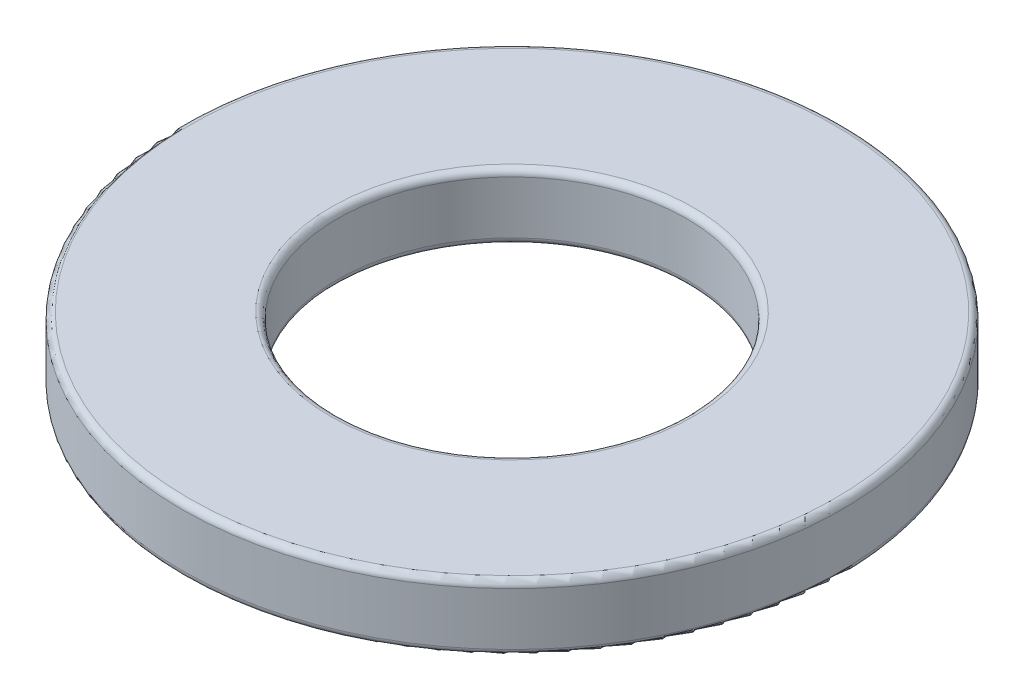
ISO-10303-21;
HEADER;
FILE_DESCRIPTION(('STEP AP214'),'2;1');
FILE_NAME('part.step','',(''),(''),'','','');
FILE_SCHEMA(('AUTOMOTIVE_DESIGN { 1 0 10303 214 1 1 1 1 }'));
ENDSEC;
DATA;
#1=APPLICATION_CONTEXT('core data for automotive mechanical design processes');
#2=APPLICATION_PROTOCOL_DEFINITION('international standard','automotive_design',2000,#1);
#3=PRODUCT_CONTEXT('',#1,'mechanical');
#4=PRODUCT('Part','Part','',(#3));
#5=PRODUCT_RELATED_PRODUCT_CATEGORY('part','',(#4));
#6=PRODUCT_DEFINITION_FORMATION('','',#4);
#7=PRODUCT_DEFINITION_CONTEXT('part definition',#1,'design');
#8=PRODUCT_DEFINITION('design','',#6,#7);
#9=PRODUCT_DEFINITION_SHAPE('','',#8);
#10=(LENGTH_UNIT() NAMED_UNIT(*) SI_UNIT(.MILLI.,.METRE.));
#11=(NAMED_UNIT(*) PLANE_ANGLE_UNIT() SI_UNIT($,.RADIAN.));
#12=(NAMED_UNIT(*) SI_UNIT($,.STERADIAN.) SOLID_ANGLE_UNIT());
#13=UNCERTAINTY_MEASURE_WITH_UNIT(LENGTH_MEASURE(1.E-05),#10,'distance_accuracy_value','');
#14=(GEOMETRIC_REPRESENTATION_CONTEXT(3) GLOBAL_UNCERTAINTY_ASSIGNED_CONTEXT((#13)) GLOBAL_UNIT_ASSIGNED_CONTEXT((#10,
#11,#12)) REPRESENTATION_CONTEXT('',''));
#15=CARTESIAN_POINT('',(0.,0.,0.));
#16=DIRECTION('',(0.,0.,1.));
#17=DIRECTION('',(1.,0.,0.));
#18=AXIS2_PLACEMENT_3D('',#15,#16,#17);
#19=CARTESIAN_POINT('',(0.,0.9,0.));
#20=DIRECTION('',(0.,1.,0.));
#21=DIRECTION('',(0.,0.,1.));
#22=AXIS2_PLACEMENT_3D('',#19,#20,#21);
#23=TOROIDAL_SURFACE('',#22,2.75,0.1);
#24=CARTESIAN_POINT('',(0.,1.,0.));
#25=DIRECTION('',(0.,-1.,0.));
#26=DIRECTION('',(0.,0.,1.));
#27=AXIS2_PLACEMENT_3D('',#24,#25,#26);
#28=CIRCLE('',#27,2.75);
#29=CARTESIAN_POINT('',(0.,1.,2.75));
#30=VERTEX_POINT('',#29);
#31=EDGE_CURVE('E73',#30,#30,#28,.T.);
#32=ORIENTED_EDGE('',*,*,#31,.F.);
#33=EDGE_LOOP('',(#32));
#34=FACE_BOUND('',#33,.T.);
#35=CARTESIAN_POINT('',(0.,0.9,0.));
#36=DIRECTION('',(0.,1.,0.));
#37=DIRECTION('',(0.,0.,1.));
#38=AXIS2_PLACEMENT_3D('',#35,#36,#37);
#39=CIRCLE('',#38,2.65);
#40=CARTESIAN_POINT('',(0.,0.9,2.65));
#41=VERTEX_POINT('',#40);
#42=EDGE_CURVE('E25',#41,#41,#39,.T.);
#43=ORIENTED_EDGE('',*,*,#42,.F.);
#44=EDGE_LOOP('',(#43));
#45=FACE_BOUND('',#44,.T.);
#46=ADVANCED_FACE('F17',(#34,#45),#23,.T.);
#47=CARTESIAN_POINT('',(0.,0.9,0.));
#48=DIRECTION('',(0.,1.,0.));
#49=DIRECTION('',(0.,0.,1.));
#50=AXIS2_PLACEMENT_3D('',#47,#48,#49);
#51=TOROIDAL_SURFACE('',#50,4.9,0.1);
#52=CARTESIAN_POINT('',(0.,0.9,0.));
#53=DIRECTION('',(0.,-1.,0.));
#54=DIRECTION('',(0.,0.,1.));
#55=AXIS2_PLACEMENT_3D('',#52,#53,#54);
#56=CIRCLE('',#55,5.);
#57=CARTESIAN_POINT('',(0.,0.9,5.));
#58=VERTEX_POINT('',#57);
#59=EDGE_CURVE('E87',#58,#58,#56,.T.);
#60=ORIENTED_EDGE('',*,*,#59,.F.);
#61=EDGE_LOOP('',(#60));
#62=FACE_BOUND('',#61,.T.);
#63=CARTESIAN_POINT('',(0.,1.,0.));
#64=DIRECTION('',(0.,1.,0.));
#65=DIRECTION('',(0.,0.,1.));
#66=AXIS2_PLACEMENT_3D('',#63,#64,#65);
#67=CIRCLE('',#66,4.9);
#68=CARTESIAN_POINT('',(0.,1.,4.9));
#69=VERTEX_POINT('',#68);
#70=EDGE_CURVE('E69',#69,#69,#67,.T.);
#71=ORIENTED_EDGE('',*,*,#70,.F.);
#72=EDGE_LOOP('',(#71));
#73=FACE_BOUND('',#72,.T.);
#74=ADVANCED_FACE('F186',(#62,#73),#51,.T.);
#75=CARTESIAN_POINT('',(0.,0.1,0.));
#76=DIRECTION('',(0.,1.,0.));
#77=DIRECTION('',(0.,0.,1.));
#78=AXIS2_PLACEMENT_3D('',#75,#76,#77);
#79=TOROIDAL_SURFACE('',#78,4.9,0.1);
#80=CARTESIAN_POINT('',(0.,0.,0.));
#81=DIRECTION('',(0.,-1.,0.));
#82=DIRECTION('',(0.,0.,1.));
#83=AXIS2_PLACEMENT_3D('',#80,#81,#82);
#84=CIRCLE('',#83,4.9);
#85=CARTESIAN_POINT('',(0.,0.,4.9));
#86=VERTEX_POINT('',#85);
#87=EDGE_CURVE('E79',#86,#86,#84,.T.);
#88=ORIENTED_EDGE('',*,*,#87,.F.);
#89=EDGE_LOOP('',(#88));
#90=FACE_BOUND('',#89,.T.);
#91=CARTESIAN_POINT('',(0.,0.1,0.));
#92=DIRECTION('',(0.,1.,0.));
#93=DIRECTION('',(0.,0.,1.));
#94=AXIS2_PLACEMENT_3D('',#91,#92,#93);
#95=CIRCLE('',#94,5.);
#96=CARTESIAN_POINT('',(0.,0.1,5.));
#97=VERTEX_POINT('',#96);
#98=EDGE_CURVE('E90',#97,#97,#95,.T.);
#99=ORIENTED_EDGE('',*,*,#98,.F.);
#100=EDGE_LOOP('',(#99));
#101=FACE_BOUND('',#100,.T.);
#102=ADVANCED_FACE('F177',(#90,#101),#79,.T.);
#103=CARTESIAN_POINT('',(0.,0.1,0.));
#104=DIRECTION('',(0.,1.,0.));
#105=DIRECTION('',(0.,0.,1.));
#106=AXIS2_PLACEMENT_3D('',#103,#104,#105);
#107=TOROIDAL_SURFACE('',#106,2.75,0.1);
#108=CARTESIAN_POINT('',(0.,0.1,0.));
#109=DIRECTION('',(0.,-1.,0.));
#110=DIRECTION('',(0.,0.,1.));
#111=AXIS2_PLACEMENT_3D('',#108,#109,#110);
#112=CIRCLE('',#111,2.65);
#113=CARTESIAN_POINT('',(0.,0.1,2.65));
#114=VERTEX_POINT('',#113);
#115=EDGE_CURVE('E11',#114,#114,#112,.T.);
#116=ORIENTED_EDGE('',*,*,#115,.F.);
#117=EDGE_LOOP('',(#116));
#118=FACE_BOUND('',#117,.T.);
#119=CARTESIAN_POINT('',(0.,0.,0.));
#120=DIRECTION('',(0.,1.,0.));
#121=DIRECTION('',(0.,0.,1.));
#122=AXIS2_PLACEMENT_3D('',#119,#120,#121);
#123=CIRCLE('',#122,2.75);
#124=CARTESIAN_POINT('',(0.,0.,2.75));
#125=VERTEX_POINT('',#124);
#126=EDGE_CURVE('E84',#125,#125,#123,.T.);
#127=ORIENTED_EDGE('',*,*,#126,.F.);
#128=EDGE_LOOP('',(#127));
#129=FACE_BOUND('',#128,.T.);
#130=ADVANCED_FACE('F169',(#118,#129),#107,.T.);
#131=CARTESIAN_POINT('',(0.,1.,0.));
#132=DIRECTION('',(0.,-1.,0.));
#133=DIRECTION('',(0.,0.,-1.));
#134=AXIS2_PLACEMENT_3D('',#131,#132,#133);
#135=CYLINDRICAL_SURFACE('',#134,2.65);
#136=ORIENTED_EDGE('',*,*,#115,.T.);
#137=EDGE_LOOP('',(#136));
#138=FACE_BOUND('',#137,.T.);
#139=ORIENTED_EDGE('',*,*,#42,.T.);
#140=EDGE_LOOP('',(#139));
#141=FACE_BOUND('',#140,.T.);
#142=ADVANCED_FACE('F160',(#138,#141),#135,.F.);
#143=CARTESIAN_POINT('',(0.,1.,0.));
#144=DIRECTION('',(0.,-1.,0.));
#145=DIRECTION('',(0.,0.,-1.));
#146=AXIS2_PLACEMENT_3D('',#143,#144,#145);
#147=CYLINDRICAL_SURFACE('',#146,5.);
#148=ORIENTED_EDGE('',*,*,#98,.T.);
#149=EDGE_LOOP('',(#148));
#150=FACE_BOUND('',#149,.T.);
#151=ORIENTED_EDGE('',*,*,#59,.T.);
#152=EDGE_LOOP('',(#151));
#153=FACE_BOUND('',#152,.T.);
#154=ADVANCED_FACE('F151',(#150,#153),#147,.T.);
#155=CARTESIAN_POINT('',(0.,0.,0.));
#156=DIRECTION('',(0.,1.,0.));
#157=DIRECTION('',(1.,0.,0.));
#158=AXIS2_PLACEMENT_3D('',#155,#156,#157);
#159=PLANE('',#158);
#160=ORIENTED_EDGE('',*,*,#126,.T.);
#161=EDGE_LOOP('',(#160));
#162=FACE_BOUND('',#161,.T.);
#163=ORIENTED_EDGE('',*,*,#87,.T.);
#164=EDGE_LOOP('',(#163));
#165=FACE_BOUND('',#164,.T.);
#166=ADVANCED_FACE('F143',(#162,#165),#159,.F.);
#167=CARTESIAN_POINT('',(0.,1.,0.));
#168=DIRECTION('',(0.,1.,0.));
#169=DIRECTION('',(1.,0.,0.));
#170=AXIS2_PLACEMENT_3D('',#167,#168,#169);
#171=PLANE('',#170);
#172=ORIENTED_EDGE('',*,*,#31,.T.);
#173=EDGE_LOOP('',(#172));
#174=FACE_BOUND('',#173,.T.);
#175=ORIENTED_EDGE('',*,*,#70,.T.);
#176=EDGE_LOOP('',(#175));
#177=FACE_BOUND('',#176,.T.);
#178=ADVANCED_FACE('F70',(#174,#177),#171,.T.);
#179=CLOSED_SHELL('',(#46,#74,#102,#130,#142,#154,#166,#178));
#180=MANIFOLD_SOLID_BREP('B1',#179);
#181=ADVANCED_BREP_SHAPE_REPRESENTATION('',(#18,#180),#14);
#182=SHAPE_DEFINITION_REPRESENTATION(#9,#181);
ENDSEC;
END-ISO-10303-21;
